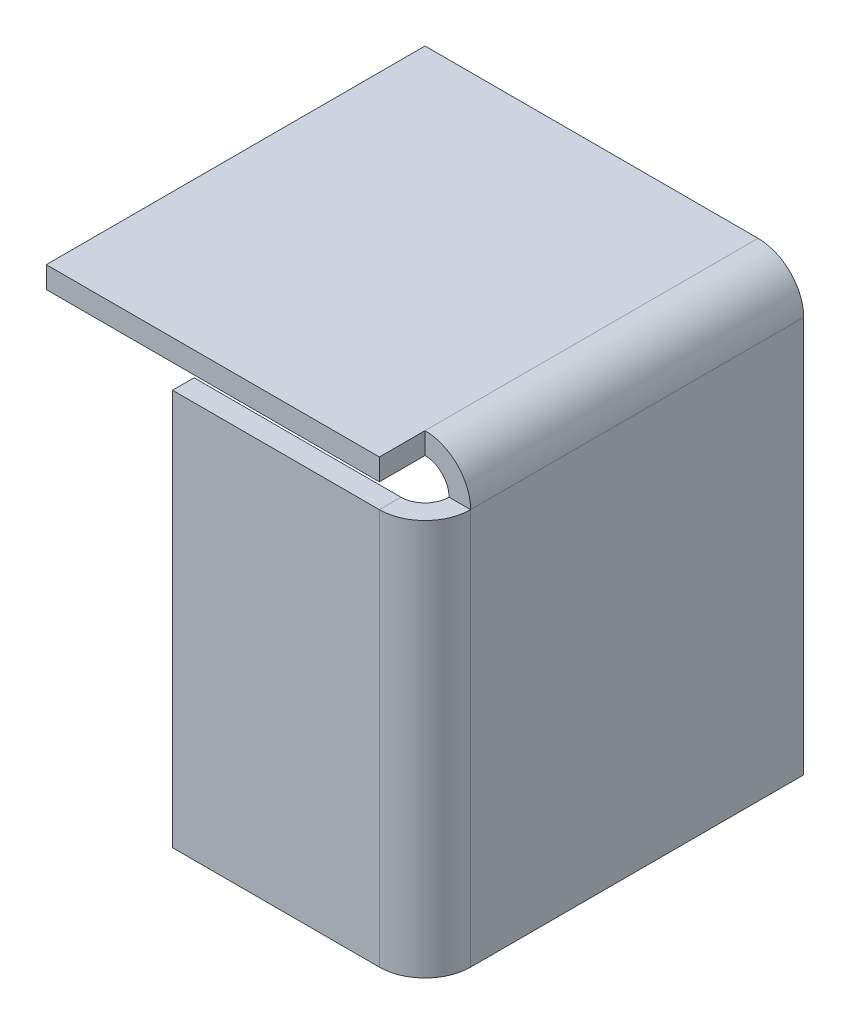
ISO-10303-21;
HEADER;
FILE_DESCRIPTION(('STEP AP214'),'2;1');
FILE_NAME('part.step','',(''),(''),'','','');
FILE_SCHEMA(('AUTOMOTIVE_DESIGN { 1 0 10303 214 1 1 1 1 }'));
ENDSEC;
DATA;
#1=APPLICATION_CONTEXT('core data for automotive mechanical design processes');
#2=APPLICATION_PROTOCOL_DEFINITION('international standard','automotive_design',2000,#1);
#3=PRODUCT_CONTEXT('',#1,'mechanical');
#4=PRODUCT('Part','Part','',(#3));
#5=PRODUCT_RELATED_PRODUCT_CATEGORY('part','',(#4));
#6=PRODUCT_DEFINITION_FORMATION('','',#4);
#7=PRODUCT_DEFINITION_CONTEXT('part definition',#1,'design');
#8=PRODUCT_DEFINITION('design','',#6,#7);
#9=PRODUCT_DEFINITION_SHAPE('','',#8);
#10=(LENGTH_UNIT() NAMED_UNIT(*) SI_UNIT(.MILLI.,.METRE.));
#11=(NAMED_UNIT(*) PLANE_ANGLE_UNIT() SI_UNIT($,.RADIAN.));
#12=(NAMED_UNIT(*) SI_UNIT($,.STERADIAN.) SOLID_ANGLE_UNIT());
#13=UNCERTAINTY_MEASURE_WITH_UNIT(LENGTH_MEASURE(1.E-05),#10,'distance_accuracy_value','');
#14=(GEOMETRIC_REPRESENTATION_CONTEXT(3) GLOBAL_UNCERTAINTY_ASSIGNED_CONTEXT((#13)) GLOBAL_UNIT_ASSIGNED_CONTEXT((#10,
#11,#12)) REPRESENTATION_CONTEXT('',''));
#15=CARTESIAN_POINT('',(0.,0.,0.));
#16=DIRECTION('',(0.,0.,1.));
#17=DIRECTION('',(1.,0.,0.));
#18=AXIS2_PLACEMENT_3D('',#15,#16,#17);
#19=CARTESIAN_POINT('',(-3.61441999999989,0.,0.));
#20=DIRECTION('',(1.,0.,0.));
#21=DIRECTION('',(0.,1.,0.));
#22=AXIS2_PLACEMENT_3D('',#19,#20,#21);
#23=PLANE('',#22);
#24=DIRECTION('',(0.,-1.,0.));
#25=VECTOR('',#24,1.);
#26=CARTESIAN_POINT('',(-3.61442000000002,35.,26.38558));
#27=LINE('',#26,#25);
#28=CARTESIAN_POINT('',(-3.61442000000002,35.,26.38558));
#29=VERTEX_POINT('',#28);
#30=CARTESIAN_POINT('',(-3.61442000000001,33.29058,26.38558));
#31=VERTEX_POINT('',#30);
#32=EDGE_CURVE('E13',#29,#31,#27,.T.);
#33=ORIENTED_EDGE('',*,*,#32,.F.);
#34=DIRECTION('',(0.,0.,-1.));
#35=VECTOR('',#34,1.);
#36=CARTESIAN_POINT('',(-3.61442000000002,35.,30.));
#37=LINE('',#36,#35);
#38=CARTESIAN_POINT('',(-3.61442000000002,35.,30.));
#39=VERTEX_POINT('',#38);
#40=EDGE_CURVE('E259',#39,#29,#37,.T.);
#41=ORIENTED_EDGE('',*,*,#40,.F.);
#42=DIRECTION('',(0.,1.,0.));
#43=VECTOR('',#42,1.);
#44=CARTESIAN_POINT('',(-3.61442000000001,33.29058,30.));
#45=LINE('',#44,#43);
#46=CARTESIAN_POINT('',(-3.61442000000001,33.29058,30.));
#47=VERTEX_POINT('',#46);
#48=EDGE_CURVE('E274',#47,#39,#45,.T.);
#49=ORIENTED_EDGE('',*,*,#48,.F.);
#50=DIRECTION('',(0.,0.,-1.));
#51=VECTOR('',#50,1.);
#52=CARTESIAN_POINT('',(-3.61442000000001,33.29058,30.));
#53=LINE('',#52,#51);
#54=EDGE_CURVE('E252',#47,#31,#53,.T.);
#55=ORIENTED_EDGE('',*,*,#54,.T.);
#56=EDGE_LOOP('',(#33,#41,#49,#55));
#57=FACE_BOUND('',#56,.T.);
#58=ADVANCED_FACE('F56',(#57),#23,.T.);
#59=CARTESIAN_POINT('',(-3.61442000000001,31.38558,30.));
#60=DIRECTION('',(0.,0.,-1.));
#61=DIRECTION('',(-1.,0.,0.));
#62=AXIS2_PLACEMENT_3D('',#59,#60,#61);
#63=CYLINDRICAL_SURFACE('',#62,3.61442);
#64=CARTESIAN_POINT('',(-3.61442000000002,35.,0.));
#65=VERTEX_POINT('',#64);
#66=EDGE_CURVE('E258',#29,#65,#37,.T.);
#67=ORIENTED_EDGE('',*,*,#66,.F.);
#68=CARTESIAN_POINT('',(-3.61442000000001,31.38558,26.38558));
#69=DIRECTION('',(0.,0.,1.));
#70=DIRECTION('',(1.,0.,0.));
#71=AXIS2_PLACEMENT_3D('',#68,#69,#70);
#72=CIRCLE('',#71,3.61442);
#73=CARTESIAN_POINT('',(0.,31.38558,26.38558));
#74=VERTEX_POINT('',#73);
#75=EDGE_CURVE('E276',#29,#74,#72,.F.);
#76=ORIENTED_EDGE('',*,*,#75,.T.);
#77=DIRECTION('',(0.,0.,-1.));
#78=VECTOR('',#77,1.);
#79=CARTESIAN_POINT('',(0.,31.38558,30.));
#80=LINE('',#79,#78);
#81=CARTESIAN_POINT('',(0.,31.38558,0.));
#82=VERTEX_POINT('',#81);
#83=EDGE_CURVE('E262',#74,#82,#80,.T.);
#84=ORIENTED_EDGE('',*,*,#83,.T.);
#85=CARTESIAN_POINT('',(-3.61442000000001,31.38558,0.));
#86=DIRECTION('',(0.,0.,1.));
#87=DIRECTION('',(1.,0.,0.));
#88=AXIS2_PLACEMENT_3D('',#85,#86,#87);
#89=CIRCLE('',#88,3.61442);
#90=EDGE_CURVE('E236',#65,#82,#89,.F.);
#91=ORIENTED_EDGE('',*,*,#90,.F.);
#92=EDGE_LOOP('',(#67,#76,#84,#91));
#93=FACE_BOUND('',#92,.T.);
#94=ADVANCED_FACE('F307',(#93),#63,.T.);
#95=CARTESIAN_POINT('',(-1.70942,35.,30.));
#96=DIRECTION('',(1.,0.,0.));
#97=DIRECTION('',(0.,1.,0.));
#98=AXIS2_PLACEMENT_3D('',#95,#96,#97);
#99=PLANE('',#98);
#100=DIRECTION('',(0.,1.,0.));
#101=VECTOR('',#100,1.);
#102=CARTESIAN_POINT('',(-1.70941999999999,31.38558,26.38558));
#103=LINE('',#102,#101);
#104=CARTESIAN_POINT('',(-1.70941999999999,31.38558,26.38558));
#105=VERTEX_POINT('',#104);
#106=CARTESIAN_POINT('',(-1.70941999999999,0.,26.38558));
#107=VERTEX_POINT('',#106);
#108=EDGE_CURVE('E208',#105,#107,#103,.F.);
#109=ORIENTED_EDGE('',*,*,#108,.F.);
#110=DIRECTION('',(0.,0.,-1.));
#111=VECTOR('',#110,1.);
#112=CARTESIAN_POINT('',(-1.70942,31.38558,30.));
#113=LINE('',#112,#111);
#114=CARTESIAN_POINT('',(-1.70942,31.38558,0.));
#115=VERTEX_POINT('',#114);
#116=EDGE_CURVE('E227',#105,#115,#113,.T.);
#117=ORIENTED_EDGE('',*,*,#116,.T.);
#118=DIRECTION('',(0.,-1.,0.));
#119=VECTOR('',#118,1.);
#120=CARTESIAN_POINT('',(-1.70942,35.,0.));
#121=LINE('',#120,#119);
#122=CARTESIAN_POINT('',(-1.70942,0.,0.));
#123=VERTEX_POINT('',#122);
#124=EDGE_CURVE('E214',#115,#123,#121,.T.);
#125=ORIENTED_EDGE('',*,*,#124,.T.);
#126=DIRECTION('',(0.,0.,-1.));
#127=VECTOR('',#126,1.);
#128=CARTESIAN_POINT('',(-1.70942,0.,30.));
#129=LINE('',#128,#127);
#130=EDGE_CURVE('E266',#107,#123,#129,.T.);
#131=ORIENTED_EDGE('',*,*,#130,.F.);
#132=EDGE_LOOP('',(#109,#117,#125,#131));
#133=FACE_BOUND('',#132,.T.);
#134=ADVANCED_FACE('F288',(#133),#99,.F.);
#135=CARTESIAN_POINT('',(0.,35.,30.));
#136=DIRECTION('',(1.,0.,0.));
#137=DIRECTION('',(0.,1.,0.));
#138=AXIS2_PLACEMENT_3D('',#135,#136,#137);
#139=PLANE('',#138);
#140=ORIENTED_EDGE('',*,*,#83,.F.);
#141=DIRECTION('',(0.,1.,0.));
#142=VECTOR('',#141,1.);
#143=CARTESIAN_POINT('',(0.,31.38558,26.38558));
#144=LINE('',#143,#142);
#145=CARTESIAN_POINT('',(0.,0.,26.38558));
#146=VERTEX_POINT('',#145);
#147=EDGE_CURVE('E154',#74,#146,#144,.F.);
#148=ORIENTED_EDGE('',*,*,#147,.T.);
#149=DIRECTION('',(0.,0.,-1.));
#150=VECTOR('',#149,1.);
#151=CARTESIAN_POINT('',(0.,0.,30.));
#152=LINE('',#151,#150);
#153=CARTESIAN_POINT('',(0.,0.,0.));
#154=VERTEX_POINT('',#153);
#155=EDGE_CURVE('E264',#146,#154,#152,.T.);
#156=ORIENTED_EDGE('',*,*,#155,.T.);
#157=DIRECTION('',(0.,-1.,0.));
#158=VECTOR('',#157,1.);
#159=CARTESIAN_POINT('',(0.,35.,0.));
#160=LINE('',#159,#158);
#161=EDGE_CURVE('E233',#82,#154,#160,.T.);
#162=ORIENTED_EDGE('',*,*,#161,.F.);
#163=EDGE_LOOP('',(#140,#148,#156,#162));
#164=FACE_BOUND('',#163,.T.);
#165=ADVANCED_FACE('F303',(#164),#139,.T.);
#166=CARTESIAN_POINT('',(-3.61442000000002,35.,0.));
#167=DIRECTION('',(0.,0.,-1.));
#168=DIRECTION('',(-1.,0.,0.));
#169=AXIS2_PLACEMENT_3D('',#166,#167,#168);
#170=PLANE('',#169);
#171=DIRECTION('',(0.,-1.,0.));
#172=VECTOR('',#171,1.);
#173=CARTESIAN_POINT('',(-3.61442000000002,35.,0.));
#174=LINE('',#173,#172);
#175=CARTESIAN_POINT('',(-3.61442000000001,33.29058,0.));
#176=VERTEX_POINT('',#175);
#177=EDGE_CURVE('E271',#65,#176,#174,.T.);
#178=ORIENTED_EDGE('',*,*,#177,.F.);
#179=ORIENTED_EDGE('',*,*,#90,.T.);
#180=DIRECTION('',(1.,0.,0.));
#181=VECTOR('',#180,1.);
#182=CARTESIAN_POINT('',(-1.70942,31.38558,0.));
#183=LINE('',#182,#181);
#184=EDGE_CURVE('E268',#115,#82,#183,.T.);
#185=ORIENTED_EDGE('',*,*,#184,.F.);
#186=CARTESIAN_POINT('',(-3.61442000000001,31.38558,0.));
#187=DIRECTION('',(0.,0.,1.));
#188=DIRECTION('',(1.,0.,0.));
#189=AXIS2_PLACEMENT_3D('',#186,#187,#188);
#190=CIRCLE('',#189,1.905);
#191=EDGE_CURVE('E221',#176,#115,#190,.F.);
#192=ORIENTED_EDGE('',*,*,#191,.F.);
#193=EDGE_LOOP('',(#178,#179,#185,#192));
#194=FACE_BOUND('',#193,.T.);
#195=ADVANCED_FACE('F312',(#194),#170,.T.);
#196=CARTESIAN_POINT('',(-1.70942,31.38558,0.));
#197=DIRECTION('',(0.,0.,-1.));
#198=DIRECTION('',(-1.,0.,0.));
#199=AXIS2_PLACEMENT_3D('',#196,#197,#198);
#200=PLANE('',#199);
#201=DIRECTION('',(1.,0.,0.));
#202=VECTOR('',#201,1.);
#203=CARTESIAN_POINT('',(-30.,35.,0.));
#204=LINE('',#203,#202);
#205=CARTESIAN_POINT('',(-30.,35.,0.));
#206=VERTEX_POINT('',#205);
#207=EDGE_CURVE('E239',#206,#65,#204,.T.);
#208=ORIENTED_EDGE('',*,*,#207,.T.);
#209=ORIENTED_EDGE('',*,*,#177,.T.);
#210=DIRECTION('',(1.,0.,0.));
#211=VECTOR('',#210,1.);
#212=CARTESIAN_POINT('',(-30.,33.29058,0.));
#213=LINE('',#212,#211);
#214=CARTESIAN_POINT('',(-30.,33.29058,0.));
#215=VERTEX_POINT('',#214);
#216=EDGE_CURVE('E245',#215,#176,#213,.T.);
#217=ORIENTED_EDGE('',*,*,#216,.F.);
#218=DIRECTION('',(0.,1.,0.));
#219=VECTOR('',#218,1.);
#220=CARTESIAN_POINT('',(-30.,33.29058,0.));
#221=LINE('',#220,#219);
#222=EDGE_CURVE('E242',#215,#206,#221,.T.);
#223=ORIENTED_EDGE('',*,*,#222,.T.);
#224=EDGE_LOOP('',(#208,#209,#217,#223));
#225=FACE_BOUND('',#224,.T.);
#226=ADVANCED_FACE('F315',(#225),#200,.T.);
#227=CARTESIAN_POINT('',(0.,0.,30.));
#228=DIRECTION('',(0.,-1.,0.));
#229=DIRECTION('',(0.,0.,-1.));
#230=AXIS2_PLACEMENT_3D('',#227,#228,#229);
#231=PLANE('',#230);
#232=DIRECTION('',(1.,0.,0.));
#233=VECTOR('',#232,1.);
#234=CARTESIAN_POINT('',(-1.70941999999999,0.,26.38558));
#235=LINE('',#234,#233);
#236=EDGE_CURVE('E211',#107,#146,#235,.T.);
#237=ORIENTED_EDGE('',*,*,#236,.F.);
#238=ORIENTED_EDGE('',*,*,#130,.T.);
#239=DIRECTION('',(-1.,0.,0.));
#240=VECTOR('',#239,1.);
#241=CARTESIAN_POINT('',(0.,0.,0.));
#242=LINE('',#241,#240);
#243=EDGE_CURVE('E230',#154,#123,#242,.T.);
#244=ORIENTED_EDGE('',*,*,#243,.F.);
#245=ORIENTED_EDGE('',*,*,#155,.F.);
#246=EDGE_LOOP('',(#237,#238,#244,#245));
#247=FACE_BOUND('',#246,.T.);
#248=ADVANCED_FACE('F298',(#247),#231,.T.);
#249=CARTESIAN_POINT('',(-3.61442000000001,31.38558,26.38558));
#250=DIRECTION('',(0.,0.,1.));
#251=DIRECTION('',(1.,0.,0.));
#252=AXIS2_PLACEMENT_3D('',#249,#250,#251);
#253=PLANE('',#252);
#254=ORIENTED_EDGE('',*,*,#75,.F.);
#255=ORIENTED_EDGE('',*,*,#32,.T.);
#256=CARTESIAN_POINT('',(-3.61442000000001,31.38558,26.38558));
#257=DIRECTION('',(0.,0.,1.));
#258=DIRECTION('',(1.,0.,0.));
#259=AXIS2_PLACEMENT_3D('',#256,#257,#258);
#260=CIRCLE('',#259,1.905);
#261=EDGE_CURVE('E63',#31,#105,#260,.F.);
#262=ORIENTED_EDGE('',*,*,#261,.T.);
#263=DIRECTION('',(1.,0.,0.));
#264=VECTOR('',#263,1.);
#265=CARTESIAN_POINT('',(-1.70941999999999,31.38558,26.38558));
#266=LINE('',#265,#264);
#267=EDGE_CURVE('E204',#105,#74,#266,.T.);
#268=ORIENTED_EDGE('',*,*,#267,.T.);
#269=EDGE_LOOP('',(#254,#255,#262,#268));
#270=FACE_BOUND('',#269,.T.);
#271=ADVANCED_FACE('F278',(#270),#253,.T.);
#272=CARTESIAN_POINT('',(-30.,35.,30.));
#273=DIRECTION('',(0.,1.,0.));
#274=DIRECTION('',(-1.,0.,0.));
#275=AXIS2_PLACEMENT_3D('',#272,#273,#274);
#276=PLANE('',#275);
#277=ORIENTED_EDGE('',*,*,#207,.F.);
#278=DIRECTION('',(0.,0.,-1.));
#279=VECTOR('',#278,1.);
#280=CARTESIAN_POINT('',(-30.,35.,30.));
#281=LINE('',#280,#279);
#282=CARTESIAN_POINT('',(-30.,35.,30.));
#283=VERTEX_POINT('',#282);
#284=EDGE_CURVE('E256',#283,#206,#281,.T.);
#285=ORIENTED_EDGE('',*,*,#284,.F.);
#286=DIRECTION('',(1.,0.,0.));
#287=VECTOR('',#286,1.);
#288=CARTESIAN_POINT('',(-30.,35.,30.));
#289=LINE('',#288,#287);
#290=EDGE_CURVE('E217',#283,#39,#289,.T.);
#291=ORIENTED_EDGE('',*,*,#290,.T.);
#292=ORIENTED_EDGE('',*,*,#40,.T.);
#293=ORIENTED_EDGE('',*,*,#66,.T.);
#294=EDGE_LOOP('',(#277,#285,#291,#292,#293));
#295=FACE_BOUND('',#294,.T.);
#296=ADVANCED_FACE('F327',(#295),#276,.T.);
#297=CARTESIAN_POINT('',(-30.,33.29058,30.));
#298=DIRECTION('',(-1.,0.,0.));
#299=DIRECTION('',(0.,0.,1.));
#300=AXIS2_PLACEMENT_3D('',#297,#298,#299);
#301=PLANE('',#300);
#302=ORIENTED_EDGE('',*,*,#222,.F.);
#303=DIRECTION('',(0.,0.,-1.));
#304=VECTOR('',#303,1.);
#305=CARTESIAN_POINT('',(-30.,33.29058,30.));
#306=LINE('',#305,#304);
#307=CARTESIAN_POINT('',(-30.,33.29058,30.));
#308=VERTEX_POINT('',#307);
#309=EDGE_CURVE('E254',#308,#215,#306,.T.);
#310=ORIENTED_EDGE('',*,*,#309,.F.);
#311=DIRECTION('',(0.,1.,0.));
#312=VECTOR('',#311,1.);
#313=CARTESIAN_POINT('',(-30.,33.29058,30.));
#314=LINE('',#313,#312);
#315=EDGE_CURVE('E220',#308,#283,#314,.T.);
#316=ORIENTED_EDGE('',*,*,#315,.T.);
#317=ORIENTED_EDGE('',*,*,#284,.T.);
#318=EDGE_LOOP('',(#302,#310,#316,#317));
#319=FACE_BOUND('',#318,.T.);
#320=ADVANCED_FACE('F324',(#319),#301,.T.);
#321=CARTESIAN_POINT('',(-30.,33.29058,30.));
#322=DIRECTION('',(0.,1.,0.));
#323=DIRECTION('',(-1.,0.,0.));
#324=AXIS2_PLACEMENT_3D('',#321,#322,#323);
#325=PLANE('',#324);
#326=ORIENTED_EDGE('',*,*,#216,.T.);
#327=EDGE_CURVE('E251',#31,#176,#53,.T.);
#328=ORIENTED_EDGE('',*,*,#327,.F.);
#329=ORIENTED_EDGE('',*,*,#54,.F.);
#330=DIRECTION('',(1.,0.,0.));
#331=VECTOR('',#330,1.);
#332=CARTESIAN_POINT('',(-30.,33.29058,30.));
#333=LINE('',#332,#331);
#334=EDGE_CURVE('E224',#308,#47,#333,.T.);
#335=ORIENTED_EDGE('',*,*,#334,.F.);
#336=ORIENTED_EDGE('',*,*,#309,.T.);
#337=EDGE_LOOP('',(#326,#328,#329,#335,#336));
#338=FACE_BOUND('',#337,.T.);
#339=ADVANCED_FACE('F319',(#338),#325,.F.);
#340=CARTESIAN_POINT('',(-3.61442000000001,31.38558,30.));
#341=DIRECTION('',(0.,0.,-1.));
#342=DIRECTION('',(-1.,0.,0.));
#343=AXIS2_PLACEMENT_3D('',#340,#341,#342);
#344=CYLINDRICAL_SURFACE('',#343,1.905);
#345=ORIENTED_EDGE('',*,*,#261,.F.);
#346=ORIENTED_EDGE('',*,*,#327,.T.);
#347=ORIENTED_EDGE('',*,*,#191,.T.);
#348=ORIENTED_EDGE('',*,*,#116,.F.);
#349=EDGE_LOOP('',(#345,#346,#347,#348));
#350=FACE_BOUND('',#349,.T.);
#351=ADVANCED_FACE('F282',(#350),#344,.F.);
#352=CARTESIAN_POINT('',(-3.61442000000001,31.38558,30.));
#353=DIRECTION('',(0.,0.,1.));
#354=DIRECTION('',(1.,0.,0.));
#355=AXIS2_PLACEMENT_3D('',#352,#353,#354);
#356=PLANE('',#355);
#357=ORIENTED_EDGE('',*,*,#334,.T.);
#358=ORIENTED_EDGE('',*,*,#48,.T.);
#359=ORIENTED_EDGE('',*,*,#290,.F.);
#360=ORIENTED_EDGE('',*,*,#315,.F.);
#361=EDGE_LOOP('',(#357,#358,#359,#360));
#362=FACE_BOUND('',#361,.T.);
#363=ADVANCED_FACE('F329',(#362),#356,.T.);
#364=CARTESIAN_POINT('',(-3.61442000000001,31.38558,0.));
#365=DIRECTION('',(0.,0.,1.));
#366=DIRECTION('',(1.,0.,0.));
#367=AXIS2_PLACEMENT_3D('',#364,#365,#366);
#368=PLANE('',#367);
#369=ORIENTED_EDGE('',*,*,#124,.F.);
#370=ORIENTED_EDGE('',*,*,#184,.T.);
#371=ORIENTED_EDGE('',*,*,#161,.T.);
#372=ORIENTED_EDGE('',*,*,#243,.T.);
#373=EDGE_LOOP('',(#369,#370,#371,#372));
#374=FACE_BOUND('',#373,.T.);
#375=ADVANCED_FACE('F309',(#374),#368,.F.);
#376=CARTESIAN_POINT('',(-3.61441999999999,0.,26.38558));
#377=DIRECTION('',(0.,-1.,0.));
#378=DIRECTION('',(0.,0.,-1.));
#379=AXIS2_PLACEMENT_3D('',#376,#377,#378);
#380=PLANE('',#379);
#381=DIRECTION('',(0.,0.,1.));
#382=VECTOR('',#381,1.);
#383=CARTESIAN_POINT('',(-3.61441999999999,0.,30.0000000000001));
#384=LINE('',#383,#382);
#385=CARTESIAN_POINT('',(-3.61441999999998,0.,28.29058));
#386=VERTEX_POINT('',#385);
#387=CARTESIAN_POINT('',(-3.61441999999998,0.,30.));
#388=VERTEX_POINT('',#387);
#389=EDGE_CURVE('E199',#386,#388,#384,.T.);
#390=ORIENTED_EDGE('',*,*,#389,.F.);
#391=CARTESIAN_POINT('',(-3.61441999999999,0.,26.38558));
#392=DIRECTION('',(0.,1.,0.));
#393=DIRECTION('',(0.,0.,1.));
#394=AXIS2_PLACEMENT_3D('',#391,#392,#393);
#395=CIRCLE('',#394,1.905);
#396=EDGE_CURVE('E157',#107,#386,#395,.F.);
#397=ORIENTED_EDGE('',*,*,#396,.F.);
#398=ORIENTED_EDGE('',*,*,#236,.T.);
#399=CARTESIAN_POINT('',(-3.61441999999999,0.,26.38558));
#400=DIRECTION('',(0.,1.,0.));
#401=DIRECTION('',(0.,0.,1.));
#402=AXIS2_PLACEMENT_3D('',#399,#400,#401);
#403=CIRCLE('',#402,3.61442);
#404=EDGE_CURVE('E203',#146,#388,#403,.F.);
#405=ORIENTED_EDGE('',*,*,#404,.T.);
#406=EDGE_LOOP('',(#390,#397,#398,#405));
#407=FACE_BOUND('',#406,.T.);
#408=ADVANCED_FACE('F295',(#407),#380,.T.);
#409=CARTESIAN_POINT('',(-3.61441999999999,31.38558,26.38558));
#410=DIRECTION('',(0.,-1.,0.));
#411=DIRECTION('',(0.,0.,-1.));
#412=AXIS2_PLACEMENT_3D('',#409,#410,#411);
#413=PLANE('',#412);
#414=CARTESIAN_POINT('',(-3.61441999999999,31.38558,26.38558));
#415=DIRECTION('',(0.,1.,0.));
#416=DIRECTION('',(0.,0.,1.));
#417=AXIS2_PLACEMENT_3D('',#414,#415,#416);
#418=CIRCLE('',#417,1.905);
#419=CARTESIAN_POINT('',(-3.61441999999998,31.38558,28.29058));
#420=VERTEX_POINT('',#419);
#421=EDGE_CURVE('E164',#420,#105,#418,.T.);
#422=ORIENTED_EDGE('',*,*,#421,.F.);
#423=DIRECTION('',(0.,0.,1.));
#424=VECTOR('',#423,1.);
#425=CARTESIAN_POINT('',(-3.61441999999999,31.38558,28.29058));
#426=LINE('',#425,#424);
#427=CARTESIAN_POINT('',(-3.61441999999999,31.38558,30.));
#428=VERTEX_POINT('',#427);
#429=EDGE_CURVE('E161',#420,#428,#426,.T.);
#430=ORIENTED_EDGE('',*,*,#429,.T.);
#431=CARTESIAN_POINT('',(-3.61441999999999,31.38558,26.38558));
#432=DIRECTION('',(0.,1.,0.));
#433=DIRECTION('',(0.,0.,1.));
#434=AXIS2_PLACEMENT_3D('',#431,#432,#433);
#435=CIRCLE('',#434,3.61442);
#436=EDGE_CURVE('E147',#428,#74,#435,.T.);
#437=ORIENTED_EDGE('',*,*,#436,.T.);
#438=ORIENTED_EDGE('',*,*,#267,.F.);
#439=EDGE_LOOP('',(#422,#430,#437,#438));
#440=FACE_BOUND('',#439,.T.);
#441=ADVANCED_FACE('F162',(#440),#413,.F.);
#442=CARTESIAN_POINT('',(-3.61441999999999,31.38558,26.38558));
#443=DIRECTION('',(0.,1.,0.));
#444=DIRECTION('',(0.,0.,1.));
#445=AXIS2_PLACEMENT_3D('',#442,#443,#444);
#446=CYLINDRICAL_SURFACE('',#445,3.61442);
#447=ORIENTED_EDGE('',*,*,#147,.F.);
#448=ORIENTED_EDGE('',*,*,#436,.F.);
#449=DIRECTION('',(0.,1.,0.));
#450=VECTOR('',#449,1.);
#451=CARTESIAN_POINT('',(-3.61441999999999,31.38558,30.));
#452=LINE('',#451,#450);
#453=EDGE_CURVE('E151',#388,#428,#452,.T.);
#454=ORIENTED_EDGE('',*,*,#453,.F.);
#455=ORIENTED_EDGE('',*,*,#404,.F.);
#456=EDGE_LOOP('',(#447,#448,#454,#455));
#457=FACE_BOUND('',#456,.T.);
#458=ADVANCED_FACE('F149',(#457),#446,.T.);
#459=CARTESIAN_POINT('',(-3.61441999999999,31.38558,26.38558));
#460=DIRECTION('',(0.,1.,0.));
#461=DIRECTION('',(0.,0.,1.));
#462=AXIS2_PLACEMENT_3D('',#459,#460,#461);
#463=CYLINDRICAL_SURFACE('',#462,1.905);
#464=ORIENTED_EDGE('',*,*,#108,.T.);
#465=ORIENTED_EDGE('',*,*,#396,.T.);
#466=DIRECTION('',(0.,-1.,0.));
#467=VECTOR('',#466,1.);
#468=CARTESIAN_POINT('',(-3.61441999999999,0.,28.29058));
#469=LINE('',#468,#467);
#470=EDGE_CURVE('E169',#386,#420,#469,.F.);
#471=ORIENTED_EDGE('',*,*,#470,.T.);
#472=ORIENTED_EDGE('',*,*,#421,.T.);
#473=EDGE_LOOP('',(#464,#465,#471,#472));
#474=FACE_BOUND('',#473,.T.);
#475=ADVANCED_FACE('F291',(#474),#463,.F.);
#476=CARTESIAN_POINT('',(-1.70942,31.38558,30.));
#477=DIRECTION('',(0.,1.,0.));
#478=DIRECTION('',(0.,0.,1.));
#479=AXIS2_PLACEMENT_3D('',#476,#477,#478);
#480=PLANE('',#479);
#481=DIRECTION('',(1.,0.,0.));
#482=VECTOR('',#481,1.);
#483=CARTESIAN_POINT('',(-1.70942,31.38558,30.));
#484=LINE('',#483,#482);
#485=CARTESIAN_POINT('',(-20.,31.38558,30.0000000000001));
#486=VERTEX_POINT('',#485);
#487=EDGE_CURVE('E176',#486,#428,#484,.T.);
#488=ORIENTED_EDGE('',*,*,#487,.T.);
#489=ORIENTED_EDGE('',*,*,#429,.F.);
#490=DIRECTION('',(-1.,0.,0.));
#491=VECTOR('',#490,1.);
#492=CARTESIAN_POINT('',(-1.70942,31.38558,28.29058));
#493=LINE('',#492,#491);
#494=CARTESIAN_POINT('',(-20.,31.38558,28.2905800000001));
#495=VERTEX_POINT('',#494);
#496=EDGE_CURVE('E192',#495,#420,#493,.F.);
#497=ORIENTED_EDGE('',*,*,#496,.F.);
#498=DIRECTION('',(0.,0.,-1.));
#499=VECTOR('',#498,1.);
#500=CARTESIAN_POINT('',(-20.,31.38558,30.0000000000001));
#501=LINE('',#500,#499);
#502=EDGE_CURVE('E181',#486,#495,#501,.T.);
#503=ORIENTED_EDGE('',*,*,#502,.F.);
#504=EDGE_LOOP('',(#488,#489,#497,#503));
#505=FACE_BOUND('',#504,.T.);
#506=ADVANCED_FACE('F180',(#505),#480,.T.);
#507=CARTESIAN_POINT('',(-20.,0.,30.0000000000001));
#508=DIRECTION('',(0.,-1.,0.));
#509=DIRECTION('',(1.,0.,0.));
#510=AXIS2_PLACEMENT_3D('',#507,#508,#509);
#511=PLANE('',#510);
#512=DIRECTION('',(1.,0.,0.));
#513=VECTOR('',#512,1.);
#514=CARTESIAN_POINT('',(-1.70941999999999,0.,28.29058));
#515=LINE('',#514,#513);
#516=CARTESIAN_POINT('',(-20.,0.,28.2905800000001));
#517=VERTEX_POINT('',#516);
#518=EDGE_CURVE('E178',#386,#517,#515,.F.);
#519=ORIENTED_EDGE('',*,*,#518,.F.);
#520=ORIENTED_EDGE('',*,*,#389,.T.);
#521=DIRECTION('',(-1.,0.,0.));
#522=VECTOR('',#521,1.);
#523=CARTESIAN_POINT('',(-20.,0.,30.0000000000001));
#524=LINE('',#523,#522);
#525=CARTESIAN_POINT('',(-20.,0.,30.0000000000001));
#526=VERTEX_POINT('',#525);
#527=EDGE_CURVE('E177',#388,#526,#524,.T.);
#528=ORIENTED_EDGE('',*,*,#527,.T.);
#529=DIRECTION('',(0.,0.,-1.));
#530=VECTOR('',#529,1.);
#531=CARTESIAN_POINT('',(-20.,0.,30.0000000000001));
#532=LINE('',#531,#530);
#533=EDGE_CURVE('E183',#526,#517,#532,.T.);
#534=ORIENTED_EDGE('',*,*,#533,.T.);
#535=EDGE_LOOP('',(#519,#520,#528,#534));
#536=FACE_BOUND('',#535,.T.);
#537=ADVANCED_FACE('F422',(#536),#511,.T.);
#538=CARTESIAN_POINT('',(-1.70942,31.38558,30.));
#539=DIRECTION('',(0.,0.,1.));
#540=DIRECTION('',(1.,0.,0.));
#541=AXIS2_PLACEMENT_3D('',#538,#539,#540);
#542=PLANE('',#541);
#543=ORIENTED_EDGE('',*,*,#527,.F.);
#544=ORIENTED_EDGE('',*,*,#453,.T.);
#545=ORIENTED_EDGE('',*,*,#487,.F.);
#546=DIRECTION('',(0.,1.,0.));
#547=VECTOR('',#546,1.);
#548=CARTESIAN_POINT('',(-20.,31.38558,30.0000000000001));
#549=LINE('',#548,#547);
#550=EDGE_CURVE('E184',#526,#486,#549,.T.);
#551=ORIENTED_EDGE('',*,*,#550,.F.);
#552=EDGE_LOOP('',(#543,#544,#545,#551));
#553=FACE_BOUND('',#552,.T.);
#554=ADVANCED_FACE('F174',(#553),#542,.T.);
#555=CARTESIAN_POINT('',(-1.70942,31.38558,28.29058));
#556=DIRECTION('',(0.,0.,1.));
#557=DIRECTION('',(1.,0.,0.));
#558=AXIS2_PLACEMENT_3D('',#555,#556,#557);
#559=PLANE('',#558);
#560=ORIENTED_EDGE('',*,*,#470,.F.);
#561=ORIENTED_EDGE('',*,*,#518,.T.);
#562=DIRECTION('',(0.,-1.,0.));
#563=VECTOR('',#562,1.);
#564=CARTESIAN_POINT('',(-20.,31.38558,28.2905800000001));
#565=LINE('',#564,#563);
#566=EDGE_CURVE('E194',#517,#495,#565,.F.);
#567=ORIENTED_EDGE('',*,*,#566,.T.);
#568=ORIENTED_EDGE('',*,*,#496,.T.);
#569=EDGE_LOOP('',(#560,#561,#567,#568));
#570=FACE_BOUND('',#569,.T.);
#571=ADVANCED_FACE('F442',(#570),#559,.F.);
#572=CARTESIAN_POINT('',(-20.,31.38558,30.0000000000001));
#573=DIRECTION('',(-1.,0.,0.));
#574=DIRECTION('',(0.,0.,1.));
#575=AXIS2_PLACEMENT_3D('',#572,#573,#574);
#576=PLANE('',#575);
#577=ORIENTED_EDGE('',*,*,#566,.F.);
#578=ORIENTED_EDGE('',*,*,#533,.F.);
#579=ORIENTED_EDGE('',*,*,#550,.T.);
#580=ORIENTED_EDGE('',*,*,#502,.T.);
#581=EDGE_LOOP('',(#577,#578,#579,#580));
#582=FACE_BOUND('',#581,.T.);
#583=ADVANCED_FACE('F452',(#582),#576,.T.);
#584=CLOSED_SHELL('',(#58,#94,#134,#165,#195,#226,#248,#271,#296,#320,#339,#351,#363,#375,#408,
#441,#458,#475,#506,#537,#554,#571,#583));
#585=MANIFOLD_SOLID_BREP('B2',#584);
#586=ADVANCED_BREP_SHAPE_REPRESENTATION('',(#18,#585),#14);
#587=SHAPE_DEFINITION_REPRESENTATION(#9,#586);
ENDSEC;
END-ISO-10303-21;
